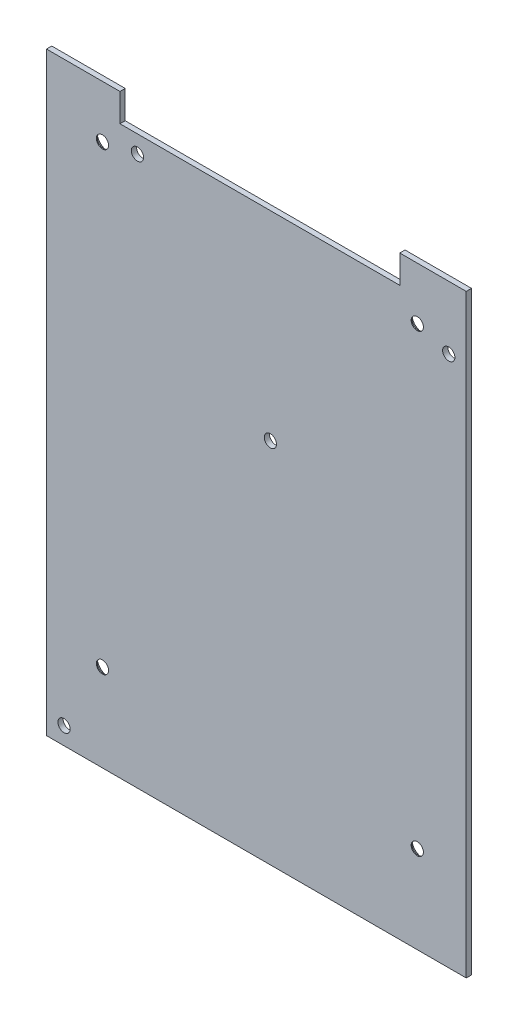
ISO-10303-21;
HEADER;
FILE_DESCRIPTION(('STEP AP214'),'2;1');
FILE_NAME('part.step','',(''),(''),'','','');
FILE_SCHEMA(('AUTOMOTIVE_DESIGN { 1 0 10303 214 1 1 1 1 }'));
ENDSEC;
DATA;
#1=APPLICATION_CONTEXT('core data for automotive mechanical design processes');
#2=APPLICATION_PROTOCOL_DEFINITION('international standard','automotive_design',2000,#1);
#3=PRODUCT_CONTEXT('',#1,'mechanical');
#4=PRODUCT('Part','Part','',(#3));
#5=PRODUCT_RELATED_PRODUCT_CATEGORY('part','',(#4));
#6=PRODUCT_DEFINITION_FORMATION('','',#4);
#7=PRODUCT_DEFINITION_CONTEXT('part definition',#1,'design');
#8=PRODUCT_DEFINITION('design','',#6,#7);
#9=PRODUCT_DEFINITION_SHAPE('','',#8);
#10=(LENGTH_UNIT() NAMED_UNIT(*) SI_UNIT(.MILLI.,.METRE.));
#11=(NAMED_UNIT(*) PLANE_ANGLE_UNIT() SI_UNIT($,.RADIAN.));
#12=(NAMED_UNIT(*) SI_UNIT($,.STERADIAN.) SOLID_ANGLE_UNIT());
#13=UNCERTAINTY_MEASURE_WITH_UNIT(LENGTH_MEASURE(1.E-05),#10,'distance_accuracy_value','');
#14=(GEOMETRIC_REPRESENTATION_CONTEXT(3) GLOBAL_UNCERTAINTY_ASSIGNED_CONTEXT((#13)) GLOBAL_UNIT_ASSIGNED_CONTEXT((#10,
#11,#12)) REPRESENTATION_CONTEXT('',''));
#15=CARTESIAN_POINT('',(0.,0.,0.));
#16=DIRECTION('',(0.,0.,1.));
#17=DIRECTION('',(1.,0.,0.));
#18=AXIS2_PLACEMENT_3D('',#15,#16,#17);
#19=CARTESIAN_POINT('',(0.,73.,1.5));
#20=DIRECTION('',(0.,-1.,0.));
#21=DIRECTION('',(0.,0.,-1.));
#22=AXIS2_PLACEMENT_3D('',#19,#20,#21);
#23=PLANE('',#22);
#24=DIRECTION('',(-1.,0.,0.));
#25=VECTOR('',#24,1.);
#26=CARTESIAN_POINT('',(0.,73.,0.));
#27=LINE('',#26,#25);
#28=CARTESIAN_POINT('',(123.,73.,0.));
#29=VERTEX_POINT('',#28);
#30=CARTESIAN_POINT('',(104.,73.,0.));
#31=VERTEX_POINT('',#30);
#32=EDGE_CURVE('E146',#29,#31,#27,.T.);
#33=ORIENTED_EDGE('',*,*,#32,.T.);
#34=DIRECTION('',(0.,0.,1.));
#35=VECTOR('',#34,1.);
#36=CARTESIAN_POINT('',(104.,73.,1.5));
#37=LINE('',#36,#35);
#38=CARTESIAN_POINT('',(104.,73.,1.5));
#39=VERTEX_POINT('',#38);
#40=EDGE_CURVE('E239',#31,#39,#37,.T.);
#41=ORIENTED_EDGE('',*,*,#40,.T.);
#42=DIRECTION('',(-1.,0.,0.));
#43=VECTOR('',#42,1.);
#44=CARTESIAN_POINT('',(0.,73.,1.5));
#45=LINE('',#44,#43);
#46=CARTESIAN_POINT('',(123.,73.,1.5));
#47=VERTEX_POINT('',#46);
#48=EDGE_CURVE('E233',#47,#39,#45,.T.);
#49=ORIENTED_EDGE('',*,*,#48,.F.);
#50=DIRECTION('',(0.,0.,-1.));
#51=VECTOR('',#50,1.);
#52=CARTESIAN_POINT('',(123.,73.,1.5));
#53=LINE('',#52,#51);
#54=EDGE_CURVE('E193',#47,#29,#53,.T.);
#55=ORIENTED_EDGE('',*,*,#54,.T.);
#56=EDGE_LOOP('',(#33,#41,#49,#55));
#57=FACE_BOUND('',#56,.T.);
#58=ADVANCED_FACE('F71',(#57),#23,.F.);
#59=CARTESIAN_POINT('',(0.,73.,1.5));
#60=DIRECTION('',(0.,0.,-1.));
#61=DIRECTION('',(-1.,0.,0.));
#62=AXIS2_PLACEMENT_3D('',#59,#60,#61);
#63=PLANE('',#62);
#64=CARTESIAN_POINT('',(8.00000000000001,-92.,1.5));
#65=DIRECTION('',(0.,0.,-1.));
#66=DIRECTION('',(-1.,0.,0.));
#67=AXIS2_PLACEMENT_3D('',#64,#65,#66);
#68=CIRCLE('',#67,1.75000000000001);
#69=CARTESIAN_POINT('',(6.25,-92.,1.5));
#70=VERTEX_POINT('',#69);
#71=EDGE_CURVE('E165',#70,#70,#68,.T.);
#72=ORIENTED_EDGE('',*,*,#71,.T.);
#73=EDGE_LOOP('',(#72));
#74=FACE_BOUND('',#73,.T.);
#75=ORIENTED_EDGE('',*,*,#48,.T.);
#76=DIRECTION('',(0.,-1.,0.));
#77=VECTOR('',#76,1.);
#78=CARTESIAN_POINT('',(104.,73.,1.5));
#79=LINE('',#78,#77);
#80=CARTESIAN_POINT('',(104.,65.,1.5));
#81=VERTEX_POINT('',#80);
#82=EDGE_CURVE('E187',#39,#81,#79,.T.);
#83=ORIENTED_EDGE('',*,*,#82,.T.);
#84=DIRECTION('',(-1.,0.,0.));
#85=VECTOR('',#84,1.);
#86=CARTESIAN_POINT('',(0.,65.,1.5));
#87=LINE('',#86,#85);
#88=CARTESIAN_POINT('',(24.,65.,1.5));
#89=VERTEX_POINT('',#88);
#90=EDGE_CURVE('E150',#81,#89,#87,.T.);
#91=ORIENTED_EDGE('',*,*,#90,.T.);
#92=DIRECTION('',(0.,1.,0.));
#93=VECTOR('',#92,1.);
#94=CARTESIAN_POINT('',(24.,73.,1.5));
#95=LINE('',#94,#93);
#96=CARTESIAN_POINT('',(24.,73.,1.5));
#97=VERTEX_POINT('',#96);
#98=EDGE_CURVE('E184',#89,#97,#95,.T.);
#99=ORIENTED_EDGE('',*,*,#98,.T.);
#100=CARTESIAN_POINT('',(3.00000000000001,73.,1.5));
#101=VERTEX_POINT('',#100);
#102=EDGE_CURVE('E94',#97,#101,#45,.T.);
#103=ORIENTED_EDGE('',*,*,#102,.T.);
#104=DIRECTION('',(0.,-1.,0.));
#105=VECTOR('',#104,1.);
#106=CARTESIAN_POINT('',(3.00000000000001,73.,1.5));
#107=LINE('',#106,#105);
#108=CARTESIAN_POINT('',(3.00000000000001,-97.,1.5));
#109=VERTEX_POINT('',#108);
#110=EDGE_CURVE('E197',#101,#109,#107,.T.);
#111=ORIENTED_EDGE('',*,*,#110,.T.);
#112=DIRECTION('',(-1.,0.,0.));
#113=VECTOR('',#112,1.);
#114=CARTESIAN_POINT('',(123.,-97.,1.5));
#115=LINE('',#114,#113);
#116=CARTESIAN_POINT('',(123.,-97.,1.5));
#117=VERTEX_POINT('',#116);
#118=EDGE_CURVE('E159',#117,#109,#115,.T.);
#119=ORIENTED_EDGE('',*,*,#118,.F.);
#120=DIRECTION('',(0.,1.,0.));
#121=VECTOR('',#120,1.);
#122=CARTESIAN_POINT('',(123.,73.,1.5));
#123=LINE('',#122,#121);
#124=EDGE_CURVE('E149',#117,#47,#123,.T.);
#125=ORIENTED_EDGE('',*,*,#124,.T.);
#126=EDGE_LOOP('',(#75,#83,#91,#99,#103,#111,#119,#125));
#127=FACE_BOUND('',#126,.T.);
#128=CARTESIAN_POINT('',(19.,58.,1.5));
#129=DIRECTION('',(0.,0.,-1.));
#130=DIRECTION('',(-1.,0.,0.));
#131=AXIS2_PLACEMENT_3D('',#128,#129,#130);
#132=CIRCLE('',#131,1.75);
#133=CARTESIAN_POINT('',(17.25,58.,1.5));
#134=VERTEX_POINT('',#133);
#135=EDGE_CURVE('E202',#134,#134,#132,.T.);
#136=ORIENTED_EDGE('',*,*,#135,.T.);
#137=EDGE_LOOP('',(#136));
#138=FACE_BOUND('',#137,.T.);
#139=CARTESIAN_POINT('',(19.,-72.,1.5));
#140=DIRECTION('',(0.,0.,-1.));
#141=DIRECTION('',(-1.,0.,0.));
#142=AXIS2_PLACEMENT_3D('',#139,#140,#141);
#143=CIRCLE('',#142,1.75);
#144=CARTESIAN_POINT('',(17.25,-72.,1.5));
#145=VERTEX_POINT('',#144);
#146=EDGE_CURVE('E205',#145,#145,#143,.T.);
#147=ORIENTED_EDGE('',*,*,#146,.T.);
#148=EDGE_LOOP('',(#147));
#149=FACE_BOUND('',#148,.T.);
#150=CARTESIAN_POINT('',(109.,-72.,1.5));
#151=DIRECTION('',(0.,0.,-1.));
#152=DIRECTION('',(-1.,0.,0.));
#153=AXIS2_PLACEMENT_3D('',#150,#151,#152);
#154=CIRCLE('',#153,1.75000000000001);
#155=CARTESIAN_POINT('',(107.25,-72.,1.5));
#156=VERTEX_POINT('',#155);
#157=EDGE_CURVE('E208',#156,#156,#154,.T.);
#158=ORIENTED_EDGE('',*,*,#157,.T.);
#159=EDGE_LOOP('',(#158));
#160=FACE_BOUND('',#159,.T.);
#161=CARTESIAN_POINT('',(109.,58.,1.5));
#162=DIRECTION('',(0.,0.,-1.));
#163=DIRECTION('',(-1.,0.,0.));
#164=AXIS2_PLACEMENT_3D('',#161,#162,#163);
#165=CIRCLE('',#164,1.75000000000001);
#166=CARTESIAN_POINT('',(107.25,58.,1.5));
#167=VERTEX_POINT('',#166);
#168=EDGE_CURVE('E211',#167,#167,#165,.T.);
#169=ORIENTED_EDGE('',*,*,#168,.T.);
#170=EDGE_LOOP('',(#169));
#171=FACE_BOUND('',#170,.T.);
#172=CARTESIAN_POINT('',(29.,60.,1.5));
#173=DIRECTION('',(0.,0.,1.));
#174=DIRECTION('',(1.,0.,0.));
#175=AXIS2_PLACEMENT_3D('',#172,#173,#174);
#176=CIRCLE('',#175,1.75);
#177=CARTESIAN_POINT('',(30.75,60.,1.5));
#178=VERTEX_POINT('',#177);
#179=EDGE_CURVE('E221',#178,#178,#176,.T.);
#180=ORIENTED_EDGE('',*,*,#179,.F.);
#181=EDGE_LOOP('',(#180));
#182=FACE_BOUND('',#181,.T.);
#183=CARTESIAN_POINT('',(118.,55.,1.5));
#184=DIRECTION('',(0.,0.,1.));
#185=DIRECTION('',(1.,0.,0.));
#186=AXIS2_PLACEMENT_3D('',#183,#184,#185);
#187=CIRCLE('',#186,1.75);
#188=CARTESIAN_POINT('',(119.75,55.,1.5));
#189=VERTEX_POINT('',#188);
#190=EDGE_CURVE('E227',#189,#189,#187,.T.);
#191=ORIENTED_EDGE('',*,*,#190,.F.);
#192=EDGE_LOOP('',(#191));
#193=FACE_BOUND('',#192,.T.);
#194=CARTESIAN_POINT('',(67.,8.,1.5));
#195=DIRECTION('',(0.,0.,1.));
#196=DIRECTION('',(1.,0.,0.));
#197=AXIS2_PLACEMENT_3D('',#194,#195,#196);
#198=CIRCLE('',#197,1.75);
#199=CARTESIAN_POINT('',(68.75,8.,1.5));
#200=VERTEX_POINT('',#199);
#201=EDGE_CURVE('E215',#200,#200,#198,.T.);
#202=ORIENTED_EDGE('',*,*,#201,.F.);
#203=EDGE_LOOP('',(#202));
#204=FACE_BOUND('',#203,.T.);
#205=ADVANCED_FACE('F279',(#74,#127,#138,#149,#160,#171,#182,#193,#204),#63,.F.);
#206=CARTESIAN_POINT('',(0.,73.,0.));
#207=DIRECTION('',(0.,0.,-1.));
#208=DIRECTION('',(-1.,0.,0.));
#209=AXIS2_PLACEMENT_3D('',#206,#207,#208);
#210=PLANE('',#209);
#211=CARTESIAN_POINT('',(19.,-72.,0.));
#212=DIRECTION('',(0.,0.,-1.));
#213=DIRECTION('',(-1.,0.,0.));
#214=AXIS2_PLACEMENT_3D('',#211,#212,#213);
#215=CIRCLE('',#214,3.);
#216=CARTESIAN_POINT('',(16.,-72.,0.));
#217=VERTEX_POINT('',#216);
#218=EDGE_CURVE('E254',#217,#217,#215,.F.);
#219=ORIENTED_EDGE('',*,*,#218,.T.);
#220=EDGE_LOOP('',(#219));
#221=FACE_BOUND('',#220,.T.);
#222=CARTESIAN_POINT('',(109.,-72.,0.));
#223=DIRECTION('',(0.,0.,-1.));
#224=DIRECTION('',(-1.,0.,0.));
#225=AXIS2_PLACEMENT_3D('',#222,#223,#224);
#226=CIRCLE('',#225,3.);
#227=CARTESIAN_POINT('',(106.,-72.,0.));
#228=VERTEX_POINT('',#227);
#229=EDGE_CURVE('E251',#228,#228,#226,.F.);
#230=ORIENTED_EDGE('',*,*,#229,.T.);
#231=EDGE_LOOP('',(#230));
#232=FACE_BOUND('',#231,.T.);
#233=CARTESIAN_POINT('',(19.,58.,0.));
#234=DIRECTION('',(0.,0.,-1.));
#235=DIRECTION('',(-1.,0.,0.));
#236=AXIS2_PLACEMENT_3D('',#233,#234,#235);
#237=CIRCLE('',#236,3.);
#238=CARTESIAN_POINT('',(16.,58.,0.));
#239=VERTEX_POINT('',#238);
#240=EDGE_CURVE('E248',#239,#239,#237,.F.);
#241=ORIENTED_EDGE('',*,*,#240,.T.);
#242=EDGE_LOOP('',(#241));
#243=FACE_BOUND('',#242,.T.);
#244=CARTESIAN_POINT('',(109.,58.,0.));
#245=DIRECTION('',(0.,0.,-1.));
#246=DIRECTION('',(-1.,0.,0.));
#247=AXIS2_PLACEMENT_3D('',#244,#245,#246);
#248=CIRCLE('',#247,3.);
#249=CARTESIAN_POINT('',(106.,58.,0.));
#250=VERTEX_POINT('',#249);
#251=EDGE_CURVE('E245',#250,#250,#248,.F.);
#252=ORIENTED_EDGE('',*,*,#251,.T.);
#253=EDGE_LOOP('',(#252));
#254=FACE_BOUND('',#253,.T.);
#255=CARTESIAN_POINT('',(8.00000000000001,-92.,0.));
#256=DIRECTION('',(0.,0.,-1.));
#257=DIRECTION('',(-1.,0.,0.));
#258=AXIS2_PLACEMENT_3D('',#255,#256,#257);
#259=CIRCLE('',#258,1.75000000000001);
#260=CARTESIAN_POINT('',(6.25,-92.,0.));
#261=VERTEX_POINT('',#260);
#262=EDGE_CURVE('E168',#261,#261,#259,.T.);
#263=ORIENTED_EDGE('',*,*,#262,.F.);
#264=EDGE_LOOP('',(#263));
#265=FACE_BOUND('',#264,.T.);
#266=DIRECTION('',(0.,-1.,0.));
#267=VECTOR('',#266,1.);
#268=CARTESIAN_POINT('',(104.,77.9239928995979,0.));
#269=LINE('',#268,#267);
#270=CARTESIAN_POINT('',(104.,65.,0.));
#271=VERTEX_POINT('',#270);
#272=EDGE_CURVE('E174',#31,#271,#269,.T.);
#273=ORIENTED_EDGE('',*,*,#272,.F.);
#274=ORIENTED_EDGE('',*,*,#32,.F.);
#275=DIRECTION('',(0.,1.,0.));
#276=VECTOR('',#275,1.);
#277=CARTESIAN_POINT('',(123.,-96.792723956213,0.));
#278=LINE('',#277,#276);
#279=CARTESIAN_POINT('',(123.,-97.,0.));
#280=VERTEX_POINT('',#279);
#281=EDGE_CURVE('E137',#280,#29,#278,.T.);
#282=ORIENTED_EDGE('',*,*,#281,.F.);
#283=DIRECTION('',(1.,0.,0.));
#284=VECTOR('',#283,1.);
#285=CARTESIAN_POINT('',(3.00000000000001,-97.,0.));
#286=LINE('',#285,#284);
#287=CARTESIAN_POINT('',(3.00000000000001,-97.,0.));
#288=VERTEX_POINT('',#287);
#289=EDGE_CURVE('E144',#288,#280,#286,.T.);
#290=ORIENTED_EDGE('',*,*,#289,.F.);
#291=DIRECTION('',(0.,-1.,0.));
#292=VECTOR('',#291,1.);
#293=CARTESIAN_POINT('',(3.00000000000001,-92.7323814283909,0.));
#294=LINE('',#293,#292);
#295=CARTESIAN_POINT('',(3.00000000000001,73.,0.));
#296=VERTEX_POINT('',#295);
#297=EDGE_CURVE('E195',#296,#288,#294,.T.);
#298=ORIENTED_EDGE('',*,*,#297,.F.);
#299=CARTESIAN_POINT('',(24.,73.,0.));
#300=VERTEX_POINT('',#299);
#301=EDGE_CURVE('E230',#300,#296,#27,.T.);
#302=ORIENTED_EDGE('',*,*,#301,.F.);
#303=DIRECTION('',(0.,1.,0.));
#304=VECTOR('',#303,1.);
#305=CARTESIAN_POINT('',(24.,77.9239928995979,0.));
#306=LINE('',#305,#304);
#307=CARTESIAN_POINT('',(24.,65.,0.));
#308=VERTEX_POINT('',#307);
#309=EDGE_CURVE('E86',#308,#300,#306,.T.);
#310=ORIENTED_EDGE('',*,*,#309,.F.);
#311=DIRECTION('',(-1.,0.,0.));
#312=VECTOR('',#311,1.);
#313=CARTESIAN_POINT('',(104.,65.,0.));
#314=LINE('',#313,#312);
#315=EDGE_CURVE('E177',#271,#308,#314,.T.);
#316=ORIENTED_EDGE('',*,*,#315,.F.);
#317=EDGE_LOOP('',(#273,#274,#282,#290,#298,#302,#310,#316));
#318=FACE_BOUND('',#317,.T.);
#319=CARTESIAN_POINT('',(29.,60.,0.));
#320=DIRECTION('',(0.,0.,1.));
#321=DIRECTION('',(1.,0.,0.));
#322=AXIS2_PLACEMENT_3D('',#319,#320,#321);
#323=CIRCLE('',#322,1.75);
#324=CARTESIAN_POINT('',(30.75,60.,0.));
#325=VERTEX_POINT('',#324);
#326=EDGE_CURVE('E218',#325,#325,#323,.T.);
#327=ORIENTED_EDGE('',*,*,#326,.T.);
#328=EDGE_LOOP('',(#327));
#329=FACE_BOUND('',#328,.T.);
#330=CARTESIAN_POINT('',(118.,55.,0.));
#331=DIRECTION('',(0.,0.,1.));
#332=DIRECTION('',(1.,0.,0.));
#333=AXIS2_PLACEMENT_3D('',#330,#331,#332);
#334=CIRCLE('',#333,1.75);
#335=CARTESIAN_POINT('',(119.75,55.,0.));
#336=VERTEX_POINT('',#335);
#337=EDGE_CURVE('E224',#336,#336,#334,.T.);
#338=ORIENTED_EDGE('',*,*,#337,.T.);
#339=EDGE_LOOP('',(#338));
#340=FACE_BOUND('',#339,.T.);
#341=CARTESIAN_POINT('',(67.,8.,0.));
#342=DIRECTION('',(0.,0.,1.));
#343=DIRECTION('',(1.,0.,0.));
#344=AXIS2_PLACEMENT_3D('',#341,#342,#343);
#345=CIRCLE('',#344,1.75);
#346=CARTESIAN_POINT('',(68.75,8.,0.));
#347=VERTEX_POINT('',#346);
#348=EDGE_CURVE('E214',#347,#347,#345,.T.);
#349=ORIENTED_EDGE('',*,*,#348,.T.);
#350=EDGE_LOOP('',(#349));
#351=FACE_BOUND('',#350,.T.);
#352=ADVANCED_FACE('F140',(#221,#232,#243,#254,#265,#318,#329,#340,#351),#210,.T.);
#353=ORIENTED_EDGE('',*,*,#102,.F.);
#354=DIRECTION('',(0.,0.,-1.));
#355=VECTOR('',#354,1.);
#356=CARTESIAN_POINT('',(24.,73.,1.5));
#357=LINE('',#356,#355);
#358=EDGE_CURVE('E236',#97,#300,#357,.T.);
#359=ORIENTED_EDGE('',*,*,#358,.T.);
#360=ORIENTED_EDGE('',*,*,#301,.T.);
#361=DIRECTION('',(0.,0.,1.));
#362=VECTOR('',#361,1.);
#363=CARTESIAN_POINT('',(3.00000000000001,73.,1.5));
#364=LINE('',#363,#362);
#365=EDGE_CURVE('E199',#296,#101,#364,.T.);
#366=ORIENTED_EDGE('',*,*,#365,.T.);
#367=EDGE_LOOP('',(#353,#359,#360,#366));
#368=FACE_BOUND('',#367,.T.);
#369=ADVANCED_FACE('F282',(#368),#23,.F.);
#370=CARTESIAN_POINT('',(118.,55.,1.5));
#371=DIRECTION('',(0.,0.,-1.));
#372=DIRECTION('',(-1.,0.,0.));
#373=AXIS2_PLACEMENT_3D('',#370,#371,#372);
#374=CYLINDRICAL_SURFACE('',#373,1.75);
#375=ORIENTED_EDGE('',*,*,#190,.T.);
#376=EDGE_LOOP('',(#375));
#377=FACE_BOUND('',#376,.T.);
#378=ORIENTED_EDGE('',*,*,#337,.F.);
#379=EDGE_LOOP('',(#378));
#380=FACE_BOUND('',#379,.T.);
#381=ADVANCED_FACE('F291',(#377,#380),#374,.F.);
#382=CARTESIAN_POINT('',(29.,60.,1.5));
#383=DIRECTION('',(0.,0.,-1.));
#384=DIRECTION('',(-1.,0.,0.));
#385=AXIS2_PLACEMENT_3D('',#382,#383,#384);
#386=CYLINDRICAL_SURFACE('',#385,1.75);
#387=ORIENTED_EDGE('',*,*,#179,.T.);
#388=EDGE_LOOP('',(#387));
#389=FACE_BOUND('',#388,.T.);
#390=ORIENTED_EDGE('',*,*,#326,.F.);
#391=EDGE_LOOP('',(#390));
#392=FACE_BOUND('',#391,.T.);
#393=ADVANCED_FACE('F297',(#389,#392),#386,.F.);
#394=CARTESIAN_POINT('',(67.,8.,1.5));
#395=DIRECTION('',(0.,0.,-1.));
#396=DIRECTION('',(-1.,0.,0.));
#397=AXIS2_PLACEMENT_3D('',#394,#395,#396);
#398=CYLINDRICAL_SURFACE('',#397,1.75);
#399=ORIENTED_EDGE('',*,*,#201,.T.);
#400=EDGE_LOOP('',(#399));
#401=FACE_BOUND('',#400,.T.);
#402=ORIENTED_EDGE('',*,*,#348,.F.);
#403=EDGE_LOOP('',(#402));
#404=FACE_BOUND('',#403,.T.);
#405=ADVANCED_FACE('F345',(#401,#404),#398,.F.);
#406=CARTESIAN_POINT('',(109.,58.,10.));
#407=DIRECTION('',(0.,0.,-1.));
#408=DIRECTION('',(-1.,0.,0.));
#409=AXIS2_PLACEMENT_3D('',#406,#407,#408);
#410=CYLINDRICAL_SURFACE('',#409,1.75000000000001);
#411=CARTESIAN_POINT('',(109.,58.,1.24999999999997));
#412=DIRECTION('',(0.,0.,-1.));
#413=DIRECTION('',(-1.,0.,0.));
#414=AXIS2_PLACEMENT_3D('',#411,#412,#413);
#415=CIRCLE('',#414,1.75000000000001);
#416=CARTESIAN_POINT('',(107.25,58.,1.24999999999997));
#417=VERTEX_POINT('',#416);
#418=EDGE_CURVE('E12',#417,#417,#415,.T.);
#419=ORIENTED_EDGE('',*,*,#418,.T.);
#420=EDGE_LOOP('',(#419));
#421=FACE_BOUND('',#420,.T.);
#422=ORIENTED_EDGE('',*,*,#168,.F.);
#423=EDGE_LOOP('',(#422));
#424=FACE_BOUND('',#423,.T.);
#425=ADVANCED_FACE('F341',(#421,#424),#410,.F.);
#426=CARTESIAN_POINT('',(109.,-72.,10.));
#427=DIRECTION('',(0.,0.,-1.));
#428=DIRECTION('',(-1.,0.,0.));
#429=AXIS2_PLACEMENT_3D('',#426,#427,#428);
#430=CYLINDRICAL_SURFACE('',#429,1.75000000000001);
#431=CARTESIAN_POINT('',(109.,-72.,1.24999999999997));
#432=DIRECTION('',(0.,0.,-1.));
#433=DIRECTION('',(-1.,0.,0.));
#434=AXIS2_PLACEMENT_3D('',#431,#432,#433);
#435=CIRCLE('',#434,1.75000000000001);
#436=CARTESIAN_POINT('',(107.25,-72.,1.24999999999997));
#437=VERTEX_POINT('',#436);
#438=EDGE_CURVE('E257',#437,#437,#435,.T.);
#439=ORIENTED_EDGE('',*,*,#438,.T.);
#440=EDGE_LOOP('',(#439));
#441=FACE_BOUND('',#440,.T.);
#442=ORIENTED_EDGE('',*,*,#157,.F.);
#443=EDGE_LOOP('',(#442));
#444=FACE_BOUND('',#443,.T.);
#445=ADVANCED_FACE('F337',(#441,#444),#430,.F.);
#446=CARTESIAN_POINT('',(19.,-72.,10.));
#447=DIRECTION('',(0.,0.,-1.));
#448=DIRECTION('',(-1.,0.,0.));
#449=AXIS2_PLACEMENT_3D('',#446,#447,#448);
#450=CYLINDRICAL_SURFACE('',#449,1.75);
#451=CARTESIAN_POINT('',(19.,-72.,1.24999999999998));
#452=DIRECTION('',(0.,0.,-1.));
#453=DIRECTION('',(-1.,0.,0.));
#454=AXIS2_PLACEMENT_3D('',#451,#452,#453);
#455=CIRCLE('',#454,1.75);
#456=CARTESIAN_POINT('',(17.25,-72.,1.24999999999998));
#457=VERTEX_POINT('',#456);
#458=EDGE_CURVE('E242',#457,#457,#455,.T.);
#459=ORIENTED_EDGE('',*,*,#458,.T.);
#460=EDGE_LOOP('',(#459));
#461=FACE_BOUND('',#460,.T.);
#462=ORIENTED_EDGE('',*,*,#146,.F.);
#463=EDGE_LOOP('',(#462));
#464=FACE_BOUND('',#463,.T.);
#465=ADVANCED_FACE('F334',(#461,#464),#450,.F.);
#466=CARTESIAN_POINT('',(19.,58.,10.));
#467=DIRECTION('',(0.,0.,-1.));
#468=DIRECTION('',(-1.,0.,0.));
#469=AXIS2_PLACEMENT_3D('',#466,#467,#468);
#470=CYLINDRICAL_SURFACE('',#469,1.75);
#471=CARTESIAN_POINT('',(19.,58.,1.24999999999998));
#472=DIRECTION('',(0.,0.,-1.));
#473=DIRECTION('',(-1.,0.,0.));
#474=AXIS2_PLACEMENT_3D('',#471,#472,#473);
#475=CIRCLE('',#474,1.75);
#476=CARTESIAN_POINT('',(17.25,58.,1.24999999999998));
#477=VERTEX_POINT('',#476);
#478=EDGE_CURVE('E79',#477,#477,#475,.T.);
#479=ORIENTED_EDGE('',*,*,#478,.T.);
#480=EDGE_LOOP('',(#479));
#481=FACE_BOUND('',#480,.T.);
#482=ORIENTED_EDGE('',*,*,#135,.F.);
#483=EDGE_LOOP('',(#482));
#484=FACE_BOUND('',#483,.T.);
#485=ADVANCED_FACE('F262',(#481,#484),#470,.F.);
#486=CARTESIAN_POINT('',(3.00000000000001,-92.7323814283909,10.));
#487=DIRECTION('',(1.,0.,0.));
#488=DIRECTION('',(0.,0.,-1.));
#489=AXIS2_PLACEMENT_3D('',#486,#487,#488);
#490=PLANE('',#489);
#491=ORIENTED_EDGE('',*,*,#297,.T.);
#492=DIRECTION('',(0.,0.,-1.));
#493=VECTOR('',#492,1.);
#494=CARTESIAN_POINT('',(3.00000000000001,-97.,1.5));
#495=LINE('',#494,#493);
#496=EDGE_CURVE('E164',#109,#288,#495,.T.);
#497=ORIENTED_EDGE('',*,*,#496,.F.);
#498=ORIENTED_EDGE('',*,*,#110,.F.);
#499=ORIENTED_EDGE('',*,*,#365,.F.);
#500=EDGE_LOOP('',(#491,#497,#498,#499));
#501=FACE_BOUND('',#500,.T.);
#502=ADVANCED_FACE('F304',(#501),#490,.F.);
#503=CARTESIAN_POINT('',(123.,-96.792723956213,10.));
#504=DIRECTION('',(-1.,0.,0.));
#505=DIRECTION('',(0.,0.,1.));
#506=AXIS2_PLACEMENT_3D('',#503,#504,#505);
#507=PLANE('',#506);
#508=ORIENTED_EDGE('',*,*,#124,.F.);
#509=DIRECTION('',(0.,0.,1.));
#510=VECTOR('',#509,1.);
#511=CARTESIAN_POINT('',(123.,-97.,0.));
#512=LINE('',#511,#510);
#513=EDGE_CURVE('E153',#280,#117,#512,.T.);
#514=ORIENTED_EDGE('',*,*,#513,.F.);
#515=ORIENTED_EDGE('',*,*,#281,.T.);
#516=ORIENTED_EDGE('',*,*,#54,.F.);
#517=EDGE_LOOP('',(#508,#514,#515,#516));
#518=FACE_BOUND('',#517,.T.);
#519=ADVANCED_FACE('F154',(#518),#507,.F.);
#520=CARTESIAN_POINT('',(104.,65.,10.));
#521=DIRECTION('',(0.,-1.,0.));
#522=DIRECTION('',(0.,0.,-1.));
#523=AXIS2_PLACEMENT_3D('',#520,#521,#522);
#524=PLANE('',#523);
#525=DIRECTION('',(0.,0.,-1.));
#526=VECTOR('',#525,1.);
#527=CARTESIAN_POINT('',(104.,65.,10.));
#528=LINE('',#527,#526);
#529=EDGE_CURVE('E181',#81,#271,#528,.T.);
#530=ORIENTED_EDGE('',*,*,#529,.T.);
#531=ORIENTED_EDGE('',*,*,#315,.T.);
#532=DIRECTION('',(0.,0.,-1.));
#533=VECTOR('',#532,1.);
#534=CARTESIAN_POINT('',(24.,65.,10.));
#535=LINE('',#534,#533);
#536=EDGE_CURVE('E182',#89,#308,#535,.T.);
#537=ORIENTED_EDGE('',*,*,#536,.F.);
#538=ORIENTED_EDGE('',*,*,#90,.F.);
#539=EDGE_LOOP('',(#530,#531,#537,#538));
#540=FACE_BOUND('',#539,.T.);
#541=ADVANCED_FACE('F308',(#540),#524,.F.);
#542=CARTESIAN_POINT('',(104.,77.9239928995979,10.));
#543=DIRECTION('',(1.,0.,0.));
#544=DIRECTION('',(0.,0.,-1.));
#545=AXIS2_PLACEMENT_3D('',#542,#543,#544);
#546=PLANE('',#545);
#547=ORIENTED_EDGE('',*,*,#40,.F.);
#548=ORIENTED_EDGE('',*,*,#272,.T.);
#549=ORIENTED_EDGE('',*,*,#529,.F.);
#550=ORIENTED_EDGE('',*,*,#82,.F.);
#551=EDGE_LOOP('',(#547,#548,#549,#550));
#552=FACE_BOUND('',#551,.T.);
#553=ADVANCED_FACE('F311',(#552),#546,.F.);
#554=CARTESIAN_POINT('',(24.,77.9239928995979,10.));
#555=DIRECTION('',(-1.,0.,0.));
#556=DIRECTION('',(0.,0.,1.));
#557=AXIS2_PLACEMENT_3D('',#554,#555,#556);
#558=PLANE('',#557);
#559=ORIENTED_EDGE('',*,*,#536,.T.);
#560=ORIENTED_EDGE('',*,*,#309,.T.);
#561=ORIENTED_EDGE('',*,*,#358,.F.);
#562=ORIENTED_EDGE('',*,*,#98,.F.);
#563=EDGE_LOOP('',(#559,#560,#561,#562));
#564=FACE_BOUND('',#563,.T.);
#565=ADVANCED_FACE('F314',(#564),#558,.F.);
#566=CARTESIAN_POINT('',(123.,-97.,0.));
#567=DIRECTION('',(0.,-1.,0.));
#568=DIRECTION('',(1.,0.,0.));
#569=AXIS2_PLACEMENT_3D('',#566,#567,#568);
#570=PLANE('',#569);
#571=ORIENTED_EDGE('',*,*,#289,.T.);
#572=ORIENTED_EDGE('',*,*,#513,.T.);
#573=ORIENTED_EDGE('',*,*,#118,.T.);
#574=ORIENTED_EDGE('',*,*,#496,.T.);
#575=EDGE_LOOP('',(#571,#572,#573,#574));
#576=FACE_BOUND('',#575,.T.);
#577=ADVANCED_FACE('F162',(#576),#570,.T.);
#578=CARTESIAN_POINT('',(8.00000000000001,-92.,20.));
#579=DIRECTION('',(0.,0.,-1.));
#580=DIRECTION('',(-1.,0.,0.));
#581=AXIS2_PLACEMENT_3D('',#578,#579,#580);
#582=CYLINDRICAL_SURFACE('',#581,1.75000000000001);
#583=ORIENTED_EDGE('',*,*,#262,.T.);
#584=EDGE_LOOP('',(#583));
#585=FACE_BOUND('',#584,.T.);
#586=ORIENTED_EDGE('',*,*,#71,.F.);
#587=EDGE_LOOP('',(#586));
#588=FACE_BOUND('',#587,.T.);
#589=ADVANCED_FACE('F321',(#585,#588),#582,.F.);
#590=CARTESIAN_POINT('',(19.,-72.,1.24999999999998));
#591=DIRECTION('',(0.,0.,-1.));
#592=DIRECTION('',(-1.,0.,0.));
#593=AXIS2_PLACEMENT_3D('',#590,#591,#592);
#594=CONICAL_SURFACE('',#593,1.75,0.785398163397457);
#595=CARTESIAN_POINT('',(16.,-72.,0.));
#596=CARTESIAN_POINT('',(16.0130208333333,-72.,0.013020833333333));
#597=CARTESIAN_POINT('',(16.0260416666667,-72.,0.0260416666666663));
#598=CARTESIAN_POINT('',(16.0520833333333,-72.,0.0520833333333328));
#599=CARTESIAN_POINT('',(16.0651041666667,-72.,0.0651041666666661));
#600=CARTESIAN_POINT('',(16.0911458333333,-72.,0.0911458333333321));
#601=CARTESIAN_POINT('',(16.1041666666667,-72.,0.104166666666665));
#602=CARTESIAN_POINT('',(16.1302083333333,-72.,0.130208333333331));
#603=CARTESIAN_POINT('',(16.1432291666667,-72.,0.143229166666664));
#604=CARTESIAN_POINT('',(16.1692708333333,-72.,0.16927083333333));
#605=CARTESIAN_POINT('',(16.1822916666667,-72.,0.182291666666663));
#606=CARTESIAN_POINT('',(16.2083333333333,-72.,0.20833333333333));
#607=CARTESIAN_POINT('',(16.2213541666667,-72.,0.221354166666663));
#608=CARTESIAN_POINT('',(16.2473958333333,-72.,0.247395833333329));
#609=CARTESIAN_POINT('',(16.2604166666667,-72.,0.260416666666662));
#610=CARTESIAN_POINT('',(16.2864583333333,-72.,0.286458333333328));
#611=CARTESIAN_POINT('',(16.2994791666667,-72.,0.299479166666661));
#612=CARTESIAN_POINT('',(16.3255208333333,-72.,0.325520833333328));
#613=CARTESIAN_POINT('',(16.3385416666667,-72.,0.338541666666661));
#614=CARTESIAN_POINT('',(16.3645833333333,-72.,0.364583333333327));
#615=CARTESIAN_POINT('',(16.3776041666667,-72.,0.37760416666666));
#616=CARTESIAN_POINT('',(16.4036458333333,-72.,0.403645833333326));
#617=CARTESIAN_POINT('',(16.4166666666667,-72.,0.416666666666659));
#618=CARTESIAN_POINT('',(16.4427083333333,-72.,0.442708333333326));
#619=CARTESIAN_POINT('',(16.4557291666667,-72.,0.455729166666658));
#620=CARTESIAN_POINT('',(16.4817708333333,-72.,0.481770833333324));
#621=CARTESIAN_POINT('',(16.4947916666667,-72.,0.494791666666657));
#622=CARTESIAN_POINT('',(16.5208333333333,-72.,0.520833333333324));
#623=CARTESIAN_POINT('',(16.5338541666667,-72.,0.533854166666657));
#624=CARTESIAN_POINT('',(16.5598958333333,-72.,0.559895833333323));
#625=CARTESIAN_POINT('',(16.5729166666667,-72.,0.572916666666656));
#626=CARTESIAN_POINT('',(16.5989583333333,-72.,0.598958333333322));
#627=CARTESIAN_POINT('',(16.6119791666667,-72.,0.611979166666655));
#628=CARTESIAN_POINT('',(16.6380208333333,-72.,0.638020833333322));
#629=CARTESIAN_POINT('',(16.6510416666667,-72.,0.651041666666655));
#630=CARTESIAN_POINT('',(16.6770833333333,-72.,0.677083333333321));
#631=CARTESIAN_POINT('',(16.6901041666667,-72.,0.690104166666654));
#632=CARTESIAN_POINT('',(16.7161458333333,-72.,0.71614583333332));
#633=CARTESIAN_POINT('',(16.7291666666667,-72.,0.729166666666654));
#634=CARTESIAN_POINT('',(16.7552083333333,-72.,0.75520833333332));
#635=CARTESIAN_POINT('',(16.7682291666667,-72.,0.768229166666652));
#636=CARTESIAN_POINT('',(16.7942708333333,-72.,0.794270833333318));
#637=CARTESIAN_POINT('',(16.8072916666667,-72.,0.807291666666652));
#638=CARTESIAN_POINT('',(16.8333333333333,-72.,0.833333333333318));
#639=CARTESIAN_POINT('',(16.8463541666667,-72.,0.846354166666651));
#640=CARTESIAN_POINT('',(16.8723958333333,-72.,0.872395833333317));
#641=CARTESIAN_POINT('',(16.8854166666667,-72.,0.885416666666651));
#642=CARTESIAN_POINT('',(16.9114583333333,-72.,0.911458333333317));
#643=CARTESIAN_POINT('',(16.9244791666667,-72.,0.92447916666665));
#644=CARTESIAN_POINT('',(16.9505208333333,-72.,0.950520833333316));
#645=CARTESIAN_POINT('',(16.9635416666667,-72.,0.963541666666649));
#646=CARTESIAN_POINT('',(16.9895833333333,-72.,0.989583333333315));
#647=CARTESIAN_POINT('',(17.0026041666667,-72.,1.00260416666665));
#648=CARTESIAN_POINT('',(17.0286458333333,-72.,1.02864583333331));
#649=CARTESIAN_POINT('',(17.0416666666667,-72.,1.04166666666665));
#650=CARTESIAN_POINT('',(17.0677083333333,-72.,1.06770833333331));
#651=CARTESIAN_POINT('',(17.0807291666667,-72.,1.08072916666665));
#652=CARTESIAN_POINT('',(17.1067708333333,-72.,1.10677083333331));
#653=CARTESIAN_POINT('',(17.1197916666667,-72.,1.11979166666665));
#654=CARTESIAN_POINT('',(17.1458333333333,-72.,1.14583333333331));
#655=CARTESIAN_POINT('',(17.1588541666667,-72.,1.15885416666665));
#656=CARTESIAN_POINT('',(17.1848958333333,-72.,1.18489583333331));
#657=CARTESIAN_POINT('',(17.1979166666667,-72.,1.19791666666664));
#658=CARTESIAN_POINT('',(17.2239583333333,-72.,1.22395833333331));
#659=CARTESIAN_POINT('',(17.2369791666667,-72.,1.23697916666664));
#660=CARTESIAN_POINT('',(17.25,-72.,1.24999999999998));
#661=B_SPLINE_CURVE_WITH_KNOTS('',3,(#595,#596,#597,#598,#599,#600,#601,#602,#603,#604,#605,
#606,#607,#608,#609,#610,#611,#612,#613,#614,#615,#616,#617,#618,#619,#620,#621,#622,#623,#624,
#625,#626,#627,#628,#629,#630,#631,#632,#633,#634,#635,#636,#637,#638,#639,#640,#641,#642,#643,
#644,#645,#646,#647,#648,#649,#650,#651,#652,#653,#654,#655,#656,#657,#658,#659,#660),
.UNSPECIFIED.,.F.,.F.,(4,2,2,2,2,2,2,2,2,2,2,2,2,2,2,2,2,2,2,2,2,2,2,2,2,2,2,2,2,2,2,2,4),(0.,
0.055242717280198,0.110485434560396,0.165728151840596,0.220970869120794,0.276213586400992,
0.33145630368119,0.38669902096139,0.441941738241588,0.497184455521786,0.552427172801984,
0.607669890082182,0.662912607362382,0.71815532464258,0.773398041922778,0.828640759202979,
0.883883476483177,0.939126193763375,0.994368911043572,1.04961162832377,1.10485434560397,
1.16009706288417,1.21533978016437,1.27058249744456,1.32582521472476,1.38106793200496,
1.43631064928516,1.49155336656536,1.54679608384556,1.60203880112576,1.65728151840595,
1.71252423568615,1.76776695296635),.UNSPECIFIED.);
#662=EDGE_CURVE('BSEAM274',#217,#457,#661,.T.);
#663=ORIENTED_EDGE('',*,*,#218,.F.);
#664=ORIENTED_EDGE('',*,*,#458,.F.);
#665=ORIENTED_EDGE('',*,*,#662,.T.);
#666=ORIENTED_EDGE('',*,*,#662,.F.);
#667=EDGE_LOOP('',(#663,#665,#664,#666));
#668=FACE_BOUND('',#667,.T.);
#669=ADVANCED_FACE('F274',(#668),#594,.F.);
#670=CARTESIAN_POINT('',(109.,-72.,1.24999999999997));
#671=DIRECTION('',(0.,0.,-1.));
#672=DIRECTION('',(-1.,0.,0.));
#673=AXIS2_PLACEMENT_3D('',#670,#671,#672);
#674=CONICAL_SURFACE('',#673,1.75000000000001,0.785398163397457);
#675=ORIENTED_EDGE('',*,*,#229,.F.);
#676=EDGE_LOOP('',(#675));
#677=FACE_BOUND('',#676,.T.);
#678=ORIENTED_EDGE('',*,*,#438,.F.);
#679=EDGE_LOOP('',(#678));
#680=FACE_BOUND('',#679,.T.);
#681=ADVANCED_FACE('F267',(#677,#680),#674,.F.);
#682=CARTESIAN_POINT('',(19.,58.,1.24999999999998));
#683=DIRECTION('',(0.,0.,-1.));
#684=DIRECTION('',(-1.,0.,0.));
#685=AXIS2_PLACEMENT_3D('',#682,#683,#684);
#686=CONICAL_SURFACE('',#685,1.75,0.785398163397457);
#687=CARTESIAN_POINT('',(16.,58.,0.));
#688=CARTESIAN_POINT('',(16.0130208333333,58.,0.013020833333333));
#689=CARTESIAN_POINT('',(16.0260416666667,58.,0.0260416666666663));
#690=CARTESIAN_POINT('',(16.0520833333333,58.,0.0520833333333328));
#691=CARTESIAN_POINT('',(16.0651041666667,58.,0.0651041666666661));
#692=CARTESIAN_POINT('',(16.0911458333333,58.,0.0911458333333321));
#693=CARTESIAN_POINT('',(16.1041666666667,58.,0.104166666666665));
#694=CARTESIAN_POINT('',(16.1302083333333,58.,0.130208333333331));
#695=CARTESIAN_POINT('',(16.1432291666667,58.,0.143229166666664));
#696=CARTESIAN_POINT('',(16.1692708333333,58.,0.16927083333333));
#697=CARTESIAN_POINT('',(16.1822916666667,58.,0.182291666666663));
#698=CARTESIAN_POINT('',(16.2083333333333,58.,0.20833333333333));
#699=CARTESIAN_POINT('',(16.2213541666667,58.,0.221354166666663));
#700=CARTESIAN_POINT('',(16.2473958333333,58.,0.247395833333329));
#701=CARTESIAN_POINT('',(16.2604166666667,58.,0.260416666666662));
#702=CARTESIAN_POINT('',(16.2864583333333,58.,0.286458333333328));
#703=CARTESIAN_POINT('',(16.2994791666667,58.,0.299479166666661));
#704=CARTESIAN_POINT('',(16.3255208333333,58.,0.325520833333328));
#705=CARTESIAN_POINT('',(16.3385416666667,58.,0.338541666666661));
#706=CARTESIAN_POINT('',(16.3645833333333,58.,0.364583333333327));
#707=CARTESIAN_POINT('',(16.3776041666667,58.,0.37760416666666));
#708=CARTESIAN_POINT('',(16.4036458333333,58.,0.403645833333326));
#709=CARTESIAN_POINT('',(16.4166666666667,58.,0.416666666666659));
#710=CARTESIAN_POINT('',(16.4427083333333,58.,0.442708333333326));
#711=CARTESIAN_POINT('',(16.4557291666667,58.,0.455729166666658));
#712=CARTESIAN_POINT('',(16.4817708333333,58.,0.481770833333324));
#713=CARTESIAN_POINT('',(16.4947916666667,58.,0.494791666666657));
#714=CARTESIAN_POINT('',(16.5208333333333,58.,0.520833333333324));
#715=CARTESIAN_POINT('',(16.5338541666667,58.,0.533854166666657));
#716=CARTESIAN_POINT('',(16.5598958333333,58.,0.559895833333323));
#717=CARTESIAN_POINT('',(16.5729166666667,58.,0.572916666666656));
#718=CARTESIAN_POINT('',(16.5989583333333,58.,0.598958333333322));
#719=CARTESIAN_POINT('',(16.6119791666667,58.,0.611979166666655));
#720=CARTESIAN_POINT('',(16.6380208333333,58.,0.638020833333322));
#721=CARTESIAN_POINT('',(16.6510416666667,58.,0.651041666666655));
#722=CARTESIAN_POINT('',(16.6770833333333,58.,0.677083333333321));
#723=CARTESIAN_POINT('',(16.6901041666667,58.,0.690104166666654));
#724=CARTESIAN_POINT('',(16.7161458333333,58.,0.71614583333332));
#725=CARTESIAN_POINT('',(16.7291666666667,58.,0.729166666666654));
#726=CARTESIAN_POINT('',(16.7552083333333,58.,0.75520833333332));
#727=CARTESIAN_POINT('',(16.7682291666667,58.,0.768229166666652));
#728=CARTESIAN_POINT('',(16.7942708333333,58.,0.794270833333318));
#729=CARTESIAN_POINT('',(16.8072916666667,58.,0.807291666666652));
#730=CARTESIAN_POINT('',(16.8333333333333,58.,0.833333333333318));
#731=CARTESIAN_POINT('',(16.8463541666667,58.,0.846354166666651));
#732=CARTESIAN_POINT('',(16.8723958333333,58.,0.872395833333317));
#733=CARTESIAN_POINT('',(16.8854166666667,58.,0.885416666666651));
#734=CARTESIAN_POINT('',(16.9114583333333,58.,0.911458333333317));
#735=CARTESIAN_POINT('',(16.9244791666667,58.,0.92447916666665));
#736=CARTESIAN_POINT('',(16.9505208333333,58.,0.950520833333316));
#737=CARTESIAN_POINT('',(16.9635416666667,58.,0.963541666666649));
#738=CARTESIAN_POINT('',(16.9895833333333,58.,0.989583333333315));
#739=CARTESIAN_POINT('',(17.0026041666667,58.,1.00260416666665));
#740=CARTESIAN_POINT('',(17.0286458333333,58.,1.02864583333331));
#741=CARTESIAN_POINT('',(17.0416666666667,58.,1.04166666666665));
#742=CARTESIAN_POINT('',(17.0677083333333,58.,1.06770833333331));
#743=CARTESIAN_POINT('',(17.0807291666667,58.,1.08072916666665));
#744=CARTESIAN_POINT('',(17.1067708333333,58.,1.10677083333331));
#745=CARTESIAN_POINT('',(17.1197916666667,58.,1.11979166666665));
#746=CARTESIAN_POINT('',(17.1458333333333,58.,1.14583333333331));
#747=CARTESIAN_POINT('',(17.1588541666667,58.,1.15885416666665));
#748=CARTESIAN_POINT('',(17.1848958333333,58.,1.18489583333331));
#749=CARTESIAN_POINT('',(17.1979166666667,58.,1.19791666666664));
#750=CARTESIAN_POINT('',(17.2239583333333,58.,1.22395833333331));
#751=CARTESIAN_POINT('',(17.2369791666667,58.,1.23697916666664));
#752=CARTESIAN_POINT('',(17.25,58.,1.24999999999998));
#753=B_SPLINE_CURVE_WITH_KNOTS('',3,(#687,#688,#689,#690,#691,#692,#693,#694,#695,#696,#697,
#698,#699,#700,#701,#702,#703,#704,#705,#706,#707,#708,#709,#710,#711,#712,#713,#714,#715,#716,
#717,#718,#719,#720,#721,#722,#723,#724,#725,#726,#727,#728,#729,#730,#731,#732,#733,#734,#735,
#736,#737,#738,#739,#740,#741,#742,#743,#744,#745,#746,#747,#748,#749,#750,#751,#752),
.UNSPECIFIED.,.F.,.F.,(4,2,2,2,2,2,2,2,2,2,2,2,2,2,2,2,2,2,2,2,2,2,2,2,2,2,2,2,2,2,2,2,4),(0.,
0.055242717280198,0.110485434560396,0.165728151840596,0.220970869120794,0.276213586400992,
0.33145630368119,0.38669902096139,0.441941738241588,0.497184455521786,0.552427172801984,
0.607669890082182,0.662912607362382,0.71815532464258,0.773398041922778,0.828640759202979,
0.883883476483177,0.939126193763375,0.994368911043572,1.04961162832377,1.10485434560397,
1.16009706288417,1.21533978016437,1.27058249744456,1.32582521472476,1.38106793200496,
1.43631064928516,1.49155336656536,1.54679608384556,1.60203880112576,1.65728151840595,
1.71252423568615,1.76776695296635),.UNSPECIFIED.);
#754=EDGE_CURVE('BSEAM265',#239,#477,#753,.T.);
#755=ORIENTED_EDGE('',*,*,#240,.F.);
#756=ORIENTED_EDGE('',*,*,#478,.F.);
#757=ORIENTED_EDGE('',*,*,#754,.T.);
#758=ORIENTED_EDGE('',*,*,#754,.F.);
#759=EDGE_LOOP('',(#755,#757,#756,#758));
#760=FACE_BOUND('',#759,.T.);
#761=ADVANCED_FACE('F265',(#760),#686,.F.);
#762=CARTESIAN_POINT('',(109.,58.,1.24999999999997));
#763=DIRECTION('',(0.,0.,-1.));
#764=DIRECTION('',(-1.,0.,0.));
#765=AXIS2_PLACEMENT_3D('',#762,#763,#764);
#766=CONICAL_SURFACE('',#765,1.75000000000001,0.785398163397457);
#767=ORIENTED_EDGE('',*,*,#251,.F.);
#768=EDGE_LOOP('',(#767));
#769=FACE_BOUND('',#768,.T.);
#770=ORIENTED_EDGE('',*,*,#418,.F.);
#771=EDGE_LOOP('',(#770));
#772=FACE_BOUND('',#771,.T.);
#773=ADVANCED_FACE('F73',(#769,#772),#766,.F.);
#774=CLOSED_SHELL('',(#58,#205,#352,#369,#381,#393,#405,#425,#445,#465,#485,#502,#519,#541,#553,
#565,#577,#589,#669,#681,#761,#773));
#775=MANIFOLD_SOLID_BREP('B2',#774);
#776=ADVANCED_BREP_SHAPE_REPRESENTATION('',(#18,#775),#14);
#777=SHAPE_DEFINITION_REPRESENTATION(#9,#776);
ENDSEC;
END-ISO-10303-21;
